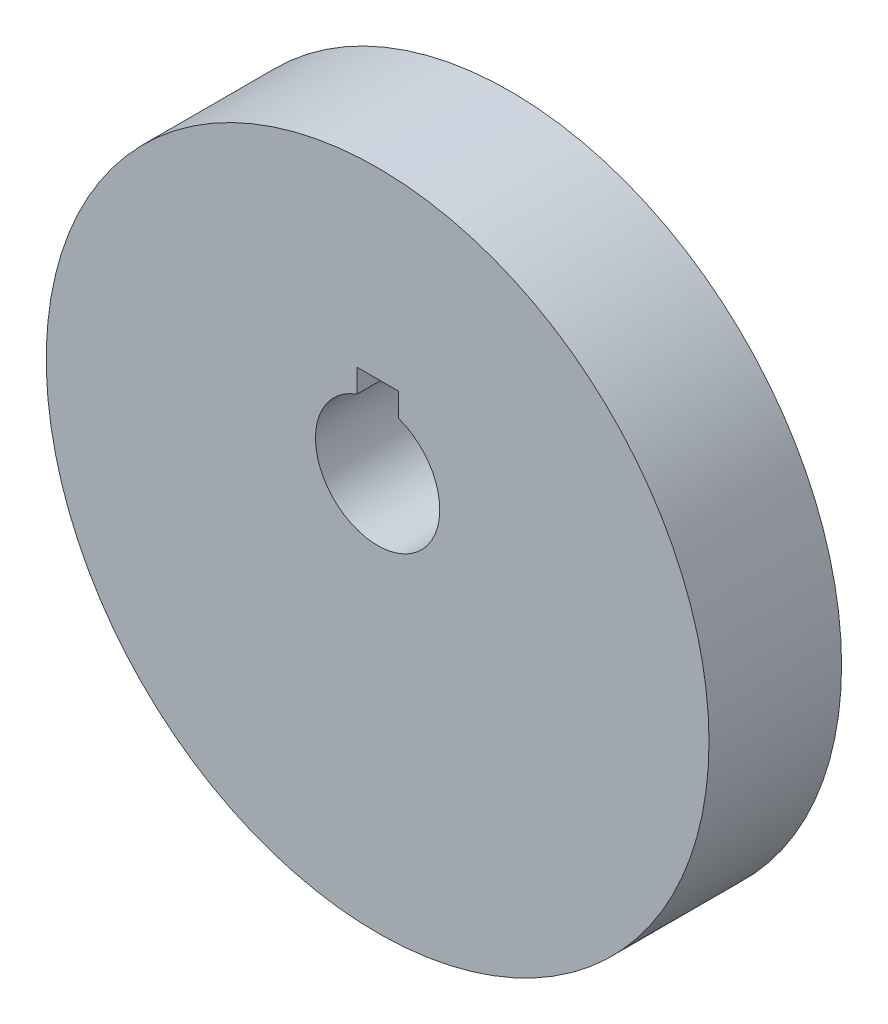
ISO-10303-21;
HEADER;
FILE_DESCRIPTION(('STEP AP214'),'2;1');
FILE_NAME('part.step','',(''),(''),'','','');
FILE_SCHEMA(('AUTOMOTIVE_DESIGN { 1 0 10303 214 1 1 1 1 }'));
ENDSEC;
DATA;
#1=APPLICATION_CONTEXT('core data for automotive mechanical design processes');
#2=APPLICATION_PROTOCOL_DEFINITION('international standard','automotive_design',2000,#1);
#3=PRODUCT_CONTEXT('',#1,'mechanical');
#4=PRODUCT('Part','Part','',(#3));
#5=PRODUCT_RELATED_PRODUCT_CATEGORY('part','',(#4));
#6=PRODUCT_DEFINITION_FORMATION('','',#4);
#7=PRODUCT_DEFINITION_CONTEXT('part definition',#1,'design');
#8=PRODUCT_DEFINITION('design','',#6,#7);
#9=PRODUCT_DEFINITION_SHAPE('','',#8);
#10=(LENGTH_UNIT() NAMED_UNIT(*) SI_UNIT(.MILLI.,.METRE.));
#11=(NAMED_UNIT(*) PLANE_ANGLE_UNIT() SI_UNIT($,.RADIAN.));
#12=(NAMED_UNIT(*) SI_UNIT($,.STERADIAN.) SOLID_ANGLE_UNIT());
#13=UNCERTAINTY_MEASURE_WITH_UNIT(LENGTH_MEASURE(1.E-05),#10,'distance_accuracy_value','');
#14=(GEOMETRIC_REPRESENTATION_CONTEXT(3) GLOBAL_UNCERTAINTY_ASSIGNED_CONTEXT((#13)) GLOBAL_UNIT_ASSIGNED_CONTEXT((#10,
#11,#12)) REPRESENTATION_CONTEXT('',''));
#15=CARTESIAN_POINT('',(0.,0.,0.));
#16=DIRECTION('',(0.,0.,1.));
#17=DIRECTION('',(1.,0.,0.));
#18=AXIS2_PLACEMENT_3D('',#15,#16,#17);
#19=CARTESIAN_POINT('',(0.,-5.08,10.16));
#20=DIRECTION('',(0.,0.,1.));
#21=DIRECTION('',(1.,0.,0.));
#22=AXIS2_PLACEMENT_3D('',#19,#20,#21);
#23=PLANE('',#22);
#24=CARTESIAN_POINT('',(0.,-5.08,10.16));
#25=DIRECTION('',(0.,0.,1.));
#26=DIRECTION('',(1.,0.,0.));
#27=AXIS2_PLACEMENT_3D('',#24,#25,#26);
#28=CIRCLE('',#27,25.4);
#29=CARTESIAN_POINT('',(25.4,-5.08,10.16));
#30=VERTEX_POINT('',#29);
#31=EDGE_CURVE('E108',#30,#30,#28,.T.);
#32=ORIENTED_EDGE('',*,*,#31,.T.);
#33=EDGE_LOOP('',(#32));
#34=FACE_BOUND('',#33,.T.);
#35=CARTESIAN_POINT('',(0.,0.,10.16));
#36=DIRECTION('',(0.,0.,1.));
#37=DIRECTION('',(1.,0.,0.));
#38=AXIS2_PLACEMENT_3D('',#35,#36,#37);
#39=CIRCLE('',#38,4.7625);
#40=CARTESIAN_POINT('',(1.5875,4.49012806053458,10.16));
#41=VERTEX_POINT('',#40);
#42=CARTESIAN_POINT('',(-1.5875,4.49012806053458,10.16));
#43=VERTEX_POINT('',#42);
#44=EDGE_CURVE('E105',#41,#43,#39,.F.);
#45=ORIENTED_EDGE('',*,*,#44,.T.);
#46=DIRECTION('',(0.,1.,0.));
#47=VECTOR('',#46,1.);
#48=CARTESIAN_POINT('',(-1.5875,-5.08,10.16));
#49=LINE('',#48,#47);
#50=CARTESIAN_POINT('',(-1.5875,6.2865,10.16));
#51=VERTEX_POINT('',#50);
#52=EDGE_CURVE('E63',#43,#51,#49,.T.);
#53=ORIENTED_EDGE('',*,*,#52,.T.);
#54=DIRECTION('',(1.,0.,0.));
#55=VECTOR('',#54,1.);
#56=CARTESIAN_POINT('',(0.,6.2865,10.16));
#57=LINE('',#56,#55);
#58=CARTESIAN_POINT('',(1.5875,6.2865,10.16));
#59=VERTEX_POINT('',#58);
#60=EDGE_CURVE('E92',#51,#59,#57,.T.);
#61=ORIENTED_EDGE('',*,*,#60,.T.);
#62=DIRECTION('',(0.,-1.,0.));
#63=VECTOR('',#62,1.);
#64=CARTESIAN_POINT('',(1.5875,-5.08,10.16));
#65=LINE('',#64,#63);
#66=EDGE_CURVE('E81',#59,#41,#65,.T.);
#67=ORIENTED_EDGE('',*,*,#66,.T.);
#68=EDGE_LOOP('',(#45,#53,#61,#67));
#69=FACE_BOUND('',#68,.T.);
#70=ADVANCED_FACE('F41',(#34,#69),#23,.T.);
#71=CARTESIAN_POINT('',(0.,-5.08,0.));
#72=DIRECTION('',(0.,0.,1.));
#73=DIRECTION('',(1.,0.,0.));
#74=AXIS2_PLACEMENT_3D('',#71,#72,#73);
#75=PLANE('',#74);
#76=CARTESIAN_POINT('',(0.,-5.08,0.));
#77=DIRECTION('',(0.,0.,1.));
#78=DIRECTION('',(1.,0.,0.));
#79=AXIS2_PLACEMENT_3D('',#76,#77,#78);
#80=CIRCLE('',#79,25.4);
#81=CARTESIAN_POINT('',(25.4,-5.08,0.));
#82=VERTEX_POINT('',#81);
#83=EDGE_CURVE('E107',#82,#82,#80,.T.);
#84=ORIENTED_EDGE('',*,*,#83,.F.);
#85=EDGE_LOOP('',(#84));
#86=FACE_BOUND('',#85,.T.);
#87=DIRECTION('',(0.,1.,0.));
#88=VECTOR('',#87,1.);
#89=CARTESIAN_POINT('',(-1.5875,-5.08,0.));
#90=LINE('',#89,#88);
#91=CARTESIAN_POINT('',(-1.5875,4.49012806053458,0.));
#92=VERTEX_POINT('',#91);
#93=CARTESIAN_POINT('',(-1.5875,6.2865,0.));
#94=VERTEX_POINT('',#93);
#95=EDGE_CURVE('E89',#92,#94,#90,.T.);
#96=ORIENTED_EDGE('',*,*,#95,.F.);
#97=CARTESIAN_POINT('',(0.,0.,0.));
#98=DIRECTION('',(0.,0.,1.));
#99=DIRECTION('',(1.,0.,0.));
#100=AXIS2_PLACEMENT_3D('',#97,#98,#99);
#101=CIRCLE('',#100,4.7625);
#102=CARTESIAN_POINT('',(1.5875,4.49012806053458,0.));
#103=VERTEX_POINT('',#102);
#104=EDGE_CURVE('E97',#103,#92,#101,.F.);
#105=ORIENTED_EDGE('',*,*,#104,.F.);
#106=DIRECTION('',(0.,-1.,0.));
#107=VECTOR('',#106,1.);
#108=CARTESIAN_POINT('',(1.5875,-5.08,0.));
#109=LINE('',#108,#107);
#110=CARTESIAN_POINT('',(1.5875,6.2865,0.));
#111=VERTEX_POINT('',#110);
#112=EDGE_CURVE('E57',#111,#103,#109,.T.);
#113=ORIENTED_EDGE('',*,*,#112,.F.);
#114=DIRECTION('',(1.,0.,0.));
#115=VECTOR('',#114,1.);
#116=CARTESIAN_POINT('',(0.,6.2865,0.));
#117=LINE('',#116,#115);
#118=EDGE_CURVE('E11',#94,#111,#117,.T.);
#119=ORIENTED_EDGE('',*,*,#118,.F.);
#120=EDGE_LOOP('',(#96,#105,#113,#119));
#121=FACE_BOUND('',#120,.T.);
#122=ADVANCED_FACE('F117',(#86,#121),#75,.F.);
#123=CARTESIAN_POINT('',(0.,0.,12.16));
#124=DIRECTION('',(0.,0.,-1.));
#125=DIRECTION('',(-1.,0.,0.));
#126=AXIS2_PLACEMENT_3D('',#123,#124,#125);
#127=CYLINDRICAL_SURFACE('',#126,4.7625);
#128=ORIENTED_EDGE('',*,*,#104,.T.);
#129=DIRECTION('',(0.,0.,-1.));
#130=VECTOR('',#129,1.);
#131=CARTESIAN_POINT('',(-1.5875,4.49012806053458,12.16));
#132=LINE('',#131,#130);
#133=EDGE_CURVE('E47',#92,#43,#132,.F.);
#134=ORIENTED_EDGE('',*,*,#133,.T.);
#135=ORIENTED_EDGE('',*,*,#44,.F.);
#136=DIRECTION('',(0.,0.,-1.));
#137=VECTOR('',#136,1.);
#138=CARTESIAN_POINT('',(1.5875,4.49012806053458,12.16));
#139=LINE('',#138,#137);
#140=EDGE_CURVE('E84',#41,#103,#139,.T.);
#141=ORIENTED_EDGE('',*,*,#140,.T.);
#142=EDGE_LOOP('',(#128,#134,#135,#141));
#143=FACE_BOUND('',#142,.T.);
#144=ADVANCED_FACE('F113',(#143),#127,.F.);
#145=CARTESIAN_POINT('',(0.,-5.08,10.16));
#146=DIRECTION('',(0.,0.,-1.));
#147=DIRECTION('',(-1.,0.,0.));
#148=AXIS2_PLACEMENT_3D('',#145,#146,#147);
#149=CYLINDRICAL_SURFACE('',#148,25.4);
#150=ORIENTED_EDGE('',*,*,#31,.F.);
#151=EDGE_LOOP('',(#150));
#152=FACE_BOUND('',#151,.T.);
#153=ORIENTED_EDGE('',*,*,#83,.T.);
#154=EDGE_LOOP('',(#153));
#155=FACE_BOUND('',#154,.T.);
#156=ADVANCED_FACE('F43',(#152,#155),#149,.T.);
#157=CARTESIAN_POINT('',(1.5875,6.2865,12.16));
#158=DIRECTION('',(0.,-1.,0.));
#159=DIRECTION('',(0.,0.,-1.));
#160=AXIS2_PLACEMENT_3D('',#157,#158,#159);
#161=PLANE('',#160);
#162=DIRECTION('',(0.,0.,-1.));
#163=VECTOR('',#162,1.);
#164=CARTESIAN_POINT('',(-1.5875,6.2865,12.16));
#165=LINE('',#164,#163);
#166=EDGE_CURVE('E100',#51,#94,#165,.T.);
#167=ORIENTED_EDGE('',*,*,#166,.T.);
#168=ORIENTED_EDGE('',*,*,#118,.T.);
#169=DIRECTION('',(0.,0.,-1.));
#170=VECTOR('',#169,1.);
#171=CARTESIAN_POINT('',(1.5875,6.2865,12.16));
#172=LINE('',#171,#170);
#173=EDGE_CURVE('E83',#59,#111,#172,.T.);
#174=ORIENTED_EDGE('',*,*,#173,.F.);
#175=ORIENTED_EDGE('',*,*,#60,.F.);
#176=EDGE_LOOP('',(#167,#168,#174,#175));
#177=FACE_BOUND('',#176,.T.);
#178=ADVANCED_FACE('F94',(#177),#161,.T.);
#179=CARTESIAN_POINT('',(-1.5875,6.2865,12.16));
#180=DIRECTION('',(1.,0.,0.));
#181=DIRECTION('',(0.,0.,-1.));
#182=AXIS2_PLACEMENT_3D('',#179,#180,#181);
#183=PLANE('',#182);
#184=ORIENTED_EDGE('',*,*,#133,.F.);
#185=ORIENTED_EDGE('',*,*,#95,.T.);
#186=ORIENTED_EDGE('',*,*,#166,.F.);
#187=ORIENTED_EDGE('',*,*,#52,.F.);
#188=EDGE_LOOP('',(#184,#185,#186,#187));
#189=FACE_BOUND('',#188,.T.);
#190=ADVANCED_FACE('F120',(#189),#183,.T.);
#191=CARTESIAN_POINT('',(1.5875,2.38125,12.16));
#192=DIRECTION('',(-1.,0.,0.));
#193=DIRECTION('',(0.,0.,1.));
#194=AXIS2_PLACEMENT_3D('',#191,#192,#193);
#195=PLANE('',#194);
#196=ORIENTED_EDGE('',*,*,#173,.T.);
#197=ORIENTED_EDGE('',*,*,#112,.T.);
#198=ORIENTED_EDGE('',*,*,#140,.F.);
#199=ORIENTED_EDGE('',*,*,#66,.F.);
#200=EDGE_LOOP('',(#196,#197,#198,#199));
#201=FACE_BOUND('',#200,.T.);
#202=ADVANCED_FACE('F82',(#201),#195,.T.);
#203=CLOSED_SHELL('',(#70,#122,#144,#156,#178,#190,#202));
#204=MANIFOLD_SOLID_BREP('B2',#203);
#205=ADVANCED_BREP_SHAPE_REPRESENTATION('',(#18,#204),#14);
#206=SHAPE_DEFINITION_REPRESENTATION(#9,#205);
ENDSEC;
END-ISO-10303-21;
